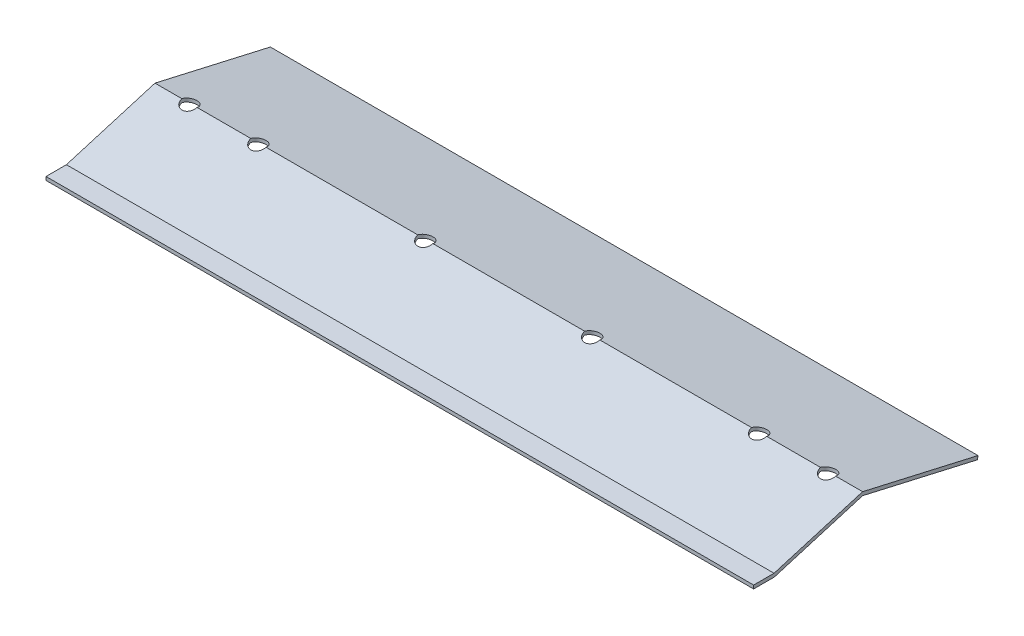
ISO-10303-21;
HEADER;
FILE_DESCRIPTION(('STEP AP214'),'2;1');
FILE_NAME('part.step','',(''),(''),'','','');
FILE_SCHEMA(('AUTOMOTIVE_DESIGN { 1 0 10303 214 1 1 1 1 }'));
ENDSEC;
DATA;
#1=APPLICATION_CONTEXT('core data for automotive mechanical design processes');
#2=APPLICATION_PROTOCOL_DEFINITION('international standard','automotive_design',2000,#1);
#3=PRODUCT_CONTEXT('',#1,'mechanical');
#4=PRODUCT('Part','Part','',(#3));
#5=PRODUCT_RELATED_PRODUCT_CATEGORY('part','',(#4));
#6=PRODUCT_DEFINITION_FORMATION('','',#4);
#7=PRODUCT_DEFINITION_CONTEXT('part definition',#1,'design');
#8=PRODUCT_DEFINITION('design','',#6,#7);
#9=PRODUCT_DEFINITION_SHAPE('','',#8);
#10=(LENGTH_UNIT() NAMED_UNIT(*) SI_UNIT(.MILLI.,.METRE.));
#11=(NAMED_UNIT(*) PLANE_ANGLE_UNIT() SI_UNIT($,.RADIAN.));
#12=(NAMED_UNIT(*) SI_UNIT($,.STERADIAN.) SOLID_ANGLE_UNIT());
#13=UNCERTAINTY_MEASURE_WITH_UNIT(LENGTH_MEASURE(1.E-05),#10,'distance_accuracy_value','');
#14=(GEOMETRIC_REPRESENTATION_CONTEXT(3) GLOBAL_UNCERTAINTY_ASSIGNED_CONTEXT((#13)) GLOBAL_UNIT_ASSIGNED_CONTEXT((#10,
#11,#12)) REPRESENTATION_CONTEXT('',''));
#15=CARTESIAN_POINT('',(0.,0.,0.));
#16=DIRECTION('',(0.,0.,1.));
#17=DIRECTION('',(1.,0.,0.));
#18=AXIS2_PLACEMENT_3D('',#15,#16,#17);
#19=CARTESIAN_POINT('',(1026.,7645.08098853702,28962.7884405451));
#20=DIRECTION('',(0.,-0.974811152910195,0.223031872524751));
#21=DIRECTION('',(0.,-0.223031872524751,-0.974811152910195));
#22=AXIS2_PLACEMENT_3D('',#19,#20,#21);
#23=PLANE('',#22);
#24=CARTESIAN_POINT('',(50.,7645.08098853702,28962.7884405451));
#25=DIRECTION('',(0.,-0.974811152910195,0.223031872524751));
#26=DIRECTION('',(0.,-0.223031872524751,-0.974811152910195));
#27=AXIS2_PLACEMENT_3D('',#24,#25,#26);
#28=ELLIPSE('',#27,11.2842369182601,11.0000000000009);
#29=CARTESIAN_POINT('',(61.0000000000009,7645.08098853702,28962.7884405451));
#30=VERTEX_POINT('',#29);
#31=CARTESIAN_POINT('',(38.9999999999991,7645.08098853702,28962.7884405451));
#32=VERTEX_POINT('',#31);
#33=EDGE_CURVE('E253',#30,#32,#28,.F.);
#34=ORIENTED_EDGE('',*,*,#33,.F.);
#35=DIRECTION('',(-1.,0.,0.));
#36=VECTOR('',#35,1.);
#37=CARTESIAN_POINT('',(1026.,7645.08098853702,28962.7884405451));
#38=LINE('',#37,#36);
#39=CARTESIAN_POINT('',(138.999999999999,7645.08098853702,28962.7884405451));
#40=VERTEX_POINT('',#39);
#41=EDGE_CURVE('E202',#40,#30,#38,.T.);
#42=ORIENTED_EDGE('',*,*,#41,.F.);
#43=CARTESIAN_POINT('',(150.,7645.08098853702,28962.7884405451));
#44=DIRECTION('',(0.,-0.974811152910195,0.223031872524751));
#45=DIRECTION('',(0.,-0.223031872524751,-0.974811152910195));
#46=AXIS2_PLACEMENT_3D('',#43,#44,#45);
#47=ELLIPSE('',#46,11.28423691826,11.0000000000009);
#48=CARTESIAN_POINT('',(161.000000000001,7645.08098853702,28962.7884405451));
#49=VERTEX_POINT('',#48);
#50=EDGE_CURVE('E258',#49,#40,#47,.F.);
#51=ORIENTED_EDGE('',*,*,#50,.F.);
#52=CARTESIAN_POINT('',(380.999999999999,7645.08098853702,28962.7884405451));
#53=VERTEX_POINT('',#52);
#54=EDGE_CURVE('E207',#53,#49,#38,.T.);
#55=ORIENTED_EDGE('',*,*,#54,.F.);
#56=CARTESIAN_POINT('',(392.,7645.08098853702,28962.7884405451));
#57=DIRECTION('',(0.,-0.974811152910195,0.223031872524751));
#58=DIRECTION('',(0.,-0.223031872524751,-0.974811152910195));
#59=AXIS2_PLACEMENT_3D('',#56,#57,#58);
#60=ELLIPSE('',#59,11.2842369182601,11.0000000000009);
#61=CARTESIAN_POINT('',(403.000000000001,7645.08098853702,28962.7884405451));
#62=VERTEX_POINT('',#61);
#63=EDGE_CURVE('E264',#62,#53,#60,.F.);
#64=ORIENTED_EDGE('',*,*,#63,.F.);
#65=CARTESIAN_POINT('',(622.999999999999,7645.08098853702,28962.7884405451));
#66=VERTEX_POINT('',#65);
#67=EDGE_CURVE('E469',#66,#62,#38,.T.);
#68=ORIENTED_EDGE('',*,*,#67,.F.);
#69=CARTESIAN_POINT('',(634.,7645.08098853702,28962.7884405451));
#70=DIRECTION('',(0.,-0.974811152910195,0.223031872524751));
#71=DIRECTION('',(0.,-0.223031872524751,-0.974811152910195));
#72=AXIS2_PLACEMENT_3D('',#69,#70,#71);
#73=ELLIPSE('',#72,11.2842369182601,11.0000000000009);
#74=CARTESIAN_POINT('',(645.000000000001,7645.08098853702,28962.7884405451));
#75=VERTEX_POINT('',#74);
#76=EDGE_CURVE('E270',#75,#66,#73,.F.);
#77=ORIENTED_EDGE('',*,*,#76,.F.);
#78=CARTESIAN_POINT('',(864.999999999999,7645.08098853702,28962.7884405451));
#79=VERTEX_POINT('',#78);
#80=EDGE_CURVE('E200',#79,#75,#38,.T.);
#81=ORIENTED_EDGE('',*,*,#80,.F.);
#82=CARTESIAN_POINT('',(876.,7645.08098853702,28962.7884405451));
#83=DIRECTION('',(0.,-0.974811152910195,0.223031872524751));
#84=DIRECTION('',(0.,-0.223031872524751,-0.974811152910195));
#85=AXIS2_PLACEMENT_3D('',#82,#83,#84);
#86=ELLIPSE('',#85,11.2842369182601,11.0000000000009);
#87=CARTESIAN_POINT('',(887.000000000001,7645.08098853702,28962.7884405451));
#88=VERTEX_POINT('',#87);
#89=EDGE_CURVE('E276',#88,#79,#86,.F.);
#90=ORIENTED_EDGE('',*,*,#89,.F.);
#91=CARTESIAN_POINT('',(964.999999999999,7645.08098853702,28962.7884405451));
#92=VERTEX_POINT('',#91);
#93=EDGE_CURVE('E187',#92,#88,#38,.T.);
#94=ORIENTED_EDGE('',*,*,#93,.F.);
#95=CARTESIAN_POINT('',(976.,7645.08098853702,28962.7884405451));
#96=DIRECTION('',(0.,-0.974811152910195,0.223031872524751));
#97=DIRECTION('',(0.,-0.223031872524751,-0.974811152910195));
#98=AXIS2_PLACEMENT_3D('',#95,#96,#97);
#99=ELLIPSE('',#98,11.2842369182601,11.0000000000009);
#100=CARTESIAN_POINT('',(987.000000000001,7645.08098853702,28962.7884405451));
#101=VERTEX_POINT('',#100);
#102=EDGE_CURVE('E172',#101,#92,#99,.F.);
#103=ORIENTED_EDGE('',*,*,#102,.F.);
#104=CARTESIAN_POINT('',(1026.,7645.08098853702,28962.7884405451));
#105=VERTEX_POINT('',#104);
#106=EDGE_CURVE('E184',#105,#101,#38,.T.);
#107=ORIENTED_EDGE('',*,*,#106,.F.);
#108=DIRECTION('',(0.,0.223031872524751,0.974811152910195));
#109=VECTOR('',#108,1.);
#110=CARTESIAN_POINT('',(1026.,7645.08098853702,28962.7884405451));
#111=LINE('',#110,#109);
#112=CARTESIAN_POINT('',(1026.,7606.80169128223,28795.4801295529));
#113=VERTEX_POINT('',#112);
#114=EDGE_CURVE('E238',#113,#105,#111,.T.);
#115=ORIENTED_EDGE('',*,*,#114,.F.);
#116=DIRECTION('',(-1.,0.,0.));
#117=VECTOR('',#116,1.);
#118=CARTESIAN_POINT('',(1026.,7606.80169128223,28795.4801295529));
#119=LINE('',#118,#117);
#120=CARTESIAN_POINT('',(0.,7606.80169128223,28795.4801295529));
#121=VERTEX_POINT('',#120);
#122=EDGE_CURVE('E194',#113,#121,#119,.T.);
#123=ORIENTED_EDGE('',*,*,#122,.T.);
#124=DIRECTION('',(0.,0.223031872524751,0.974811152910195));
#125=VECTOR('',#124,1.);
#126=CARTESIAN_POINT('',(0.,7645.08098853702,28962.7884405451));
#127=LINE('',#126,#125);
#128=CARTESIAN_POINT('',(0.,7645.08098853702,28962.7884405451));
#129=VERTEX_POINT('',#128);
#130=EDGE_CURVE('E222',#121,#129,#127,.T.);
#131=ORIENTED_EDGE('',*,*,#130,.T.);
#132=EDGE_CURVE('E196',#32,#129,#38,.T.);
#133=ORIENTED_EDGE('',*,*,#132,.F.);
#134=EDGE_LOOP('',(#34,#42,#51,#55,#64,#68,#77,#81,#90,#94,#103,#107,#115,#123,#131,#133));
#135=FACE_BOUND('',#134,.T.);
#136=ADVANCED_FACE('F33',(#135),#23,.F.);
#137=CARTESIAN_POINT('',(1026.,7606.86746050729,29091.1952717385));
#138=DIRECTION('',(0.,-0.958457773485265,-0.285234458727674));
#139=DIRECTION('',(0.,0.285234458727674,-0.958457773485265));
#140=AXIS2_PLACEMENT_3D('',#137,#138,#139);
#141=PLANE('',#140);
#142=CARTESIAN_POINT('',(50.,7645.08098853702,28962.7884405451));
#143=DIRECTION('',(0.,-0.958457773485265,-0.285234458727674));
#144=DIRECTION('',(0.,-0.285234458727674,0.958457773485265));
#145=AXIS2_PLACEMENT_3D('',#142,#143,#144);
#146=ELLIPSE('',#145,11.4767706040938,11.0000000000009);
#147=EDGE_CURVE('E11',#32,#30,#146,.F.);
#148=ORIENTED_EDGE('',*,*,#147,.F.);
#149=ORIENTED_EDGE('',*,*,#132,.T.);
#150=DIRECTION('',(0.,-0.285234458727674,0.958457773485265));
#151=VECTOR('',#150,1.);
#152=CARTESIAN_POINT('',(0.,7606.86746050729,29091.1952717385));
#153=LINE('',#152,#151);
#154=CARTESIAN_POINT('',(0.,7606.86746050729,29091.1952717385));
#155=VERTEX_POINT('',#154);
#156=EDGE_CURVE('E220',#129,#155,#153,.T.);
#157=ORIENTED_EDGE('',*,*,#156,.T.);
#158=DIRECTION('',(-1.,0.,0.));
#159=VECTOR('',#158,1.);
#160=CARTESIAN_POINT('',(1026.,7606.86746050729,29091.1952717385));
#161=LINE('',#160,#159);
#162=CARTESIAN_POINT('',(1026.,7606.86746050729,29091.1952717385));
#163=VERTEX_POINT('',#162);
#164=EDGE_CURVE('E203',#163,#155,#161,.T.);
#165=ORIENTED_EDGE('',*,*,#164,.F.);
#166=DIRECTION('',(0.,-0.285234458727674,0.958457773485265));
#167=VECTOR('',#166,1.);
#168=CARTESIAN_POINT('',(1026.,7606.86746050729,29091.1952717385));
#169=LINE('',#168,#167);
#170=EDGE_CURVE('E193',#105,#163,#169,.T.);
#171=ORIENTED_EDGE('',*,*,#170,.F.);
#172=ORIENTED_EDGE('',*,*,#106,.T.);
#173=CARTESIAN_POINT('',(976.,7645.08098853702,28962.7884405451));
#174=DIRECTION('',(0.,-0.958457773485265,-0.285234458727674));
#175=DIRECTION('',(0.,-0.285234458727674,0.958457773485265));
#176=AXIS2_PLACEMENT_3D('',#173,#174,#175);
#177=ELLIPSE('',#176,11.4767706040938,11.0000000000009);
#178=EDGE_CURVE('E168',#92,#101,#177,.F.);
#179=ORIENTED_EDGE('',*,*,#178,.F.);
#180=ORIENTED_EDGE('',*,*,#93,.T.);
#181=CARTESIAN_POINT('',(876.,7645.08098853702,28962.7884405451));
#182=DIRECTION('',(0.,-0.958457773485265,-0.285234458727674));
#183=DIRECTION('',(0.,-0.285234458727674,0.958457773485265));
#184=AXIS2_PLACEMENT_3D('',#181,#182,#183);
#185=ELLIPSE('',#184,11.4767706040938,11.0000000000009);
#186=EDGE_CURVE('E177',#79,#88,#185,.F.);
#187=ORIENTED_EDGE('',*,*,#186,.F.);
#188=ORIENTED_EDGE('',*,*,#80,.T.);
#189=CARTESIAN_POINT('',(634.,7645.08098853702,28962.7884405451));
#190=DIRECTION('',(0.,-0.958457773485265,-0.285234458727674));
#191=DIRECTION('',(0.,-0.285234458727674,0.958457773485265));
#192=AXIS2_PLACEMENT_3D('',#189,#190,#191);
#193=ELLIPSE('',#192,11.4767706040938,11.0000000000009);
#194=EDGE_CURVE('E475',#66,#75,#193,.F.);
#195=ORIENTED_EDGE('',*,*,#194,.F.);
#196=ORIENTED_EDGE('',*,*,#67,.T.);
#197=CARTESIAN_POINT('',(392.,7645.08098853702,28962.7884405451));
#198=DIRECTION('',(0.,-0.958457773485265,-0.285234458727674));
#199=DIRECTION('',(0.,-0.285234458727674,0.958457773485265));
#200=AXIS2_PLACEMENT_3D('',#197,#198,#199);
#201=ELLIPSE('',#200,11.4767706040938,11.0000000000009);
#202=EDGE_CURVE('E468',#53,#62,#201,.F.);
#203=ORIENTED_EDGE('',*,*,#202,.F.);
#204=ORIENTED_EDGE('',*,*,#54,.T.);
#205=CARTESIAN_POINT('',(150.,7645.08098853702,28962.7884405451));
#206=DIRECTION('',(0.,-0.958457773485265,-0.285234458727674));
#207=DIRECTION('',(0.,-0.285234458727674,0.958457773485265));
#208=AXIS2_PLACEMENT_3D('',#205,#206,#207);
#209=ELLIPSE('',#208,11.4767706040938,11.0000000000009);
#210=EDGE_CURVE('E41',#40,#49,#209,.F.);
#211=ORIENTED_EDGE('',*,*,#210,.F.);
#212=ORIENTED_EDGE('',*,*,#41,.T.);
#213=EDGE_LOOP('',(#148,#149,#157,#165,#171,#172,#179,#180,#187,#188,#195,#196,#203,#204,#211,#212));
#214=FACE_BOUND('',#213,.T.);
#215=ADVANCED_FACE('F191',(#214),#141,.F.);
#216=CARTESIAN_POINT('',(1026.,7601.86746050729,29120.7884405453));
#217=DIRECTION('',(0.,-7.10542735759232E-13,-1.));
#218=DIRECTION('',(0.,1.,-7.10542735759232E-13));
#219=AXIS2_PLACEMENT_3D('',#216,#217,#218);
#220=PLANE('',#219);
#221=DIRECTION('',(0.,-1.,7.10542735759232E-13));
#222=VECTOR('',#221,1.);
#223=CARTESIAN_POINT('',(0.,7601.86746050729,29120.7884405453));
#224=LINE('',#223,#222);
#225=CARTESIAN_POINT('',(0.,7606.86746050729,29120.7884405453));
#226=VERTEX_POINT('',#225);
#227=CARTESIAN_POINT('',(0.,7601.86746050729,29120.7884405453));
#228=VERTEX_POINT('',#227);
#229=EDGE_CURVE('E233',#226,#228,#224,.T.);
#230=ORIENTED_EDGE('',*,*,#229,.T.);
#231=DIRECTION('',(-1.,0.,0.));
#232=VECTOR('',#231,1.);
#233=CARTESIAN_POINT('',(1026.,7601.86746050729,29120.7884405453));
#234=LINE('',#233,#232);
#235=CARTESIAN_POINT('',(1026.,7601.86746050729,29120.7884405453));
#236=VERTEX_POINT('',#235);
#237=EDGE_CURVE('E178',#236,#228,#234,.T.);
#238=ORIENTED_EDGE('',*,*,#237,.F.);
#239=DIRECTION('',(0.,-1.,7.10542735759232E-13));
#240=VECTOR('',#239,1.);
#241=CARTESIAN_POINT('',(1026.,7601.86746050729,29120.7884405453));
#242=LINE('',#241,#240);
#243=CARTESIAN_POINT('',(1026.,7606.86746050729,29120.7884405453));
#244=VERTEX_POINT('',#243);
#245=EDGE_CURVE('E219',#244,#236,#242,.T.);
#246=ORIENTED_EDGE('',*,*,#245,.F.);
#247=DIRECTION('',(-1.,0.,0.));
#248=VECTOR('',#247,1.);
#249=CARTESIAN_POINT('',(1026.,7606.86746050729,29120.7884405453));
#250=LINE('',#249,#248);
#251=EDGE_CURVE('E209',#244,#226,#250,.T.);
#252=ORIENTED_EDGE('',*,*,#251,.T.);
#253=EDGE_LOOP('',(#230,#238,#246,#252));
#254=FACE_BOUND('',#253,.T.);
#255=ADVANCED_FACE('F35',(#254),#220,.F.);
#256=CARTESIAN_POINT('',(1026.,7601.86746050729,29090.7884405453));
#257=DIRECTION('',(0.,1.,0.));
#258=DIRECTION('',(0.,0.,1.));
#259=AXIS2_PLACEMENT_3D('',#256,#257,#258);
#260=PLANE('',#259);
#261=DIRECTION('',(0.,0.,-1.));
#262=VECTOR('',#261,1.);
#263=CARTESIAN_POINT('',(0.,7601.86746050729,29090.7884405453));
#264=LINE('',#263,#262);
#265=CARTESIAN_POINT('',(0.,7601.86746050729,29090.7884405453));
#266=VERTEX_POINT('',#265);
#267=EDGE_CURVE('E231',#228,#266,#264,.T.);
#268=ORIENTED_EDGE('',*,*,#267,.T.);
#269=DIRECTION('',(-1.,0.,0.));
#270=VECTOR('',#269,1.);
#271=CARTESIAN_POINT('',(1026.,7601.86746050729,29090.7884405453));
#272=LINE('',#271,#270);
#273=CARTESIAN_POINT('',(1026.,7601.86746050729,29090.7884405453));
#274=VERTEX_POINT('',#273);
#275=EDGE_CURVE('E296',#274,#266,#272,.T.);
#276=ORIENTED_EDGE('',*,*,#275,.F.);
#277=DIRECTION('',(0.,0.,-1.));
#278=VECTOR('',#277,1.);
#279=CARTESIAN_POINT('',(1026.,7601.86746050729,29090.7884405453));
#280=LINE('',#279,#278);
#281=EDGE_CURVE('E246',#236,#274,#280,.T.);
#282=ORIENTED_EDGE('',*,*,#281,.F.);
#283=ORIENTED_EDGE('',*,*,#237,.T.);
#284=EDGE_LOOP('',(#268,#276,#282,#283));
#285=FACE_BOUND('',#284,.T.);
#286=ADVANCED_FACE('F326',(#285),#260,.F.);
#287=CARTESIAN_POINT('',(1026.,7640.01434266244,28962.7884405451));
#288=DIRECTION('',(0.,0.958346298160574,0.285608775778904));
#289=DIRECTION('',(0.,-0.285608775778904,0.958346298160574));
#290=AXIS2_PLACEMENT_3D('',#287,#288,#289);
#291=PLANE('',#290);
#292=CARTESIAN_POINT('',(50.,7640.01434266244,28962.7884405451));
#293=DIRECTION('',(0.,0.958346298160574,0.285608775778904));
#294=DIRECTION('',(0.,-0.285608775778904,0.958346298160574));
#295=AXIS2_PLACEMENT_3D('',#292,#293,#294);
#296=ELLIPSE('',#295,11.4781055878381,11.0000000000009);
#297=CARTESIAN_POINT('',(61.0000000000009,7640.01434266244,28962.7884405451));
#298=VERTEX_POINT('',#297);
#299=CARTESIAN_POINT('',(38.9999999999991,7640.01434266244,28962.7884405451));
#300=VERTEX_POINT('',#299);
#301=EDGE_CURVE('E47',#298,#300,#296,.F.);
#302=ORIENTED_EDGE('',*,*,#301,.F.);
#303=DIRECTION('',(-1.,0.,0.));
#304=VECTOR('',#303,1.);
#305=CARTESIAN_POINT('',(1026.,7640.01434266244,28962.7884405451));
#306=LINE('',#305,#304);
#307=CARTESIAN_POINT('',(138.999999999999,7640.01434266244,28962.7884405451));
#308=VERTEX_POINT('',#307);
#309=EDGE_CURVE('E303',#308,#298,#306,.T.);
#310=ORIENTED_EDGE('',*,*,#309,.F.);
#311=CARTESIAN_POINT('',(150.,7640.01434266244,28962.7884405451));
#312=DIRECTION('',(0.,0.958346298160574,0.285608775778904));
#313=DIRECTION('',(0.,-0.285608775778904,0.958346298160574));
#314=AXIS2_PLACEMENT_3D('',#311,#312,#313);
#315=ELLIPSE('',#314,11.4781055878381,11.0000000000009);
#316=CARTESIAN_POINT('',(161.000000000001,7640.01434266244,28962.7884405451));
#317=VERTEX_POINT('',#316);
#318=EDGE_CURVE('E54',#317,#308,#315,.F.);
#319=ORIENTED_EDGE('',*,*,#318,.F.);
#320=CARTESIAN_POINT('',(380.999999999999,7640.01434266244,28962.7884405451));
#321=VERTEX_POINT('',#320);
#322=EDGE_CURVE('E306',#321,#317,#306,.T.);
#323=ORIENTED_EDGE('',*,*,#322,.F.);
#324=CARTESIAN_POINT('',(392.,7640.01434266244,28962.7884405451));
#325=DIRECTION('',(0.,0.958346298160574,0.285608775778904));
#326=DIRECTION('',(0.,-0.285608775778904,0.958346298160574));
#327=AXIS2_PLACEMENT_3D('',#324,#325,#326);
#328=ELLIPSE('',#327,11.4781055878382,11.0000000000009);
#329=CARTESIAN_POINT('',(403.000000000001,7640.01434266244,28962.7884405451));
#330=VERTEX_POINT('',#329);
#331=EDGE_CURVE('E260',#330,#321,#328,.F.);
#332=ORIENTED_EDGE('',*,*,#331,.F.);
#333=CARTESIAN_POINT('',(622.999999999999,7640.01434266244,28962.7884405451));
#334=VERTEX_POINT('',#333);
#335=EDGE_CURVE('E488',#334,#330,#306,.T.);
#336=ORIENTED_EDGE('',*,*,#335,.F.);
#337=CARTESIAN_POINT('',(634.,7640.01434266244,28962.7884405451));
#338=DIRECTION('',(0.,0.958346298160574,0.285608775778904));
#339=DIRECTION('',(0.,-0.285608775778904,0.958346298160574));
#340=AXIS2_PLACEMENT_3D('',#337,#338,#339);
#341=ELLIPSE('',#340,11.4781055878382,11.0000000000009);
#342=CARTESIAN_POINT('',(645.000000000001,7640.01434266244,28962.7884405451));
#343=VERTEX_POINT('',#342);
#344=EDGE_CURVE('E266',#343,#334,#341,.F.);
#345=ORIENTED_EDGE('',*,*,#344,.F.);
#346=CARTESIAN_POINT('',(864.999999999999,7640.01434266244,28962.7884405451));
#347=VERTEX_POINT('',#346);
#348=EDGE_CURVE('E301',#347,#343,#306,.T.);
#349=ORIENTED_EDGE('',*,*,#348,.F.);
#350=CARTESIAN_POINT('',(876.,7640.01434266244,28962.7884405451));
#351=DIRECTION('',(0.,0.958346298160574,0.285608775778904));
#352=DIRECTION('',(0.,-0.285608775778904,0.958346298160574));
#353=AXIS2_PLACEMENT_3D('',#350,#351,#352);
#354=ELLIPSE('',#353,11.4781055878382,11.0000000000009);
#355=CARTESIAN_POINT('',(887.000000000001,7640.01434266244,28962.7884405451));
#356=VERTEX_POINT('',#355);
#357=EDGE_CURVE('E272',#356,#347,#354,.F.);
#358=ORIENTED_EDGE('',*,*,#357,.F.);
#359=CARTESIAN_POINT('',(964.999999999999,7640.01434266244,28962.7884405451));
#360=VERTEX_POINT('',#359);
#361=EDGE_CURVE('E293',#360,#356,#306,.T.);
#362=ORIENTED_EDGE('',*,*,#361,.F.);
#363=CARTESIAN_POINT('',(976.,7640.01434266244,28962.7884405451));
#364=DIRECTION('',(0.,0.958346298160574,0.285608775778904));
#365=DIRECTION('',(0.,-0.285608775778904,0.958346298160574));
#366=AXIS2_PLACEMENT_3D('',#363,#364,#365);
#367=ELLIPSE('',#366,11.4781055878382,11.0000000000009);
#368=CARTESIAN_POINT('',(987.000000000001,7640.01434266244,28962.7884405451));
#369=VERTEX_POINT('',#368);
#370=EDGE_CURVE('E278',#369,#360,#367,.F.);
#371=ORIENTED_EDGE('',*,*,#370,.F.);
#372=CARTESIAN_POINT('',(1026.,7640.01434266244,28962.7884405451));
#373=VERTEX_POINT('',#372);
#374=EDGE_CURVE('E290',#373,#369,#306,.T.);
#375=ORIENTED_EDGE('',*,*,#374,.F.);
#376=DIRECTION('',(0.,0.285608775778904,-0.958346298160574));
#377=VECTOR('',#376,1.);
#378=CARTESIAN_POINT('',(1026.,7640.01434266244,28962.7884405451));
#379=LINE('',#378,#377);
#380=EDGE_CURVE('E244',#274,#373,#379,.T.);
#381=ORIENTED_EDGE('',*,*,#380,.F.);
#382=ORIENTED_EDGE('',*,*,#275,.T.);
#383=DIRECTION('',(0.,0.285608775778904,-0.958346298160574));
#384=VECTOR('',#383,1.);
#385=CARTESIAN_POINT('',(0.,7640.01434266244,28962.7884405451));
#386=LINE('',#385,#384);
#387=CARTESIAN_POINT('',(0.,7640.01434266244,28962.7884405451));
#388=VERTEX_POINT('',#387);
#389=EDGE_CURVE('E228',#266,#388,#386,.T.);
#390=ORIENTED_EDGE('',*,*,#389,.T.);
#391=EDGE_CURVE('E298',#300,#388,#306,.T.);
#392=ORIENTED_EDGE('',*,*,#391,.F.);
#393=EDGE_LOOP('',(#302,#310,#319,#323,#332,#336,#345,#349,#358,#362,#371,#375,#381,#382,#390,#392));
#394=FACE_BOUND('',#393,.T.);
#395=ADVANCED_FACE('F288',(#394),#291,.F.);
#396=CARTESIAN_POINT('',(1026.,7601.86746050729,28796.2884405449));
#397=DIRECTION('',(0.,0.974744258070148,-0.223324050113899));
#398=DIRECTION('',(0.,0.2233240501139,0.974744258070149));
#399=AXIS2_PLACEMENT_3D('',#396,#397,#398);
#400=PLANE('',#399);
#401=CARTESIAN_POINT('',(50.,7640.01434266244,28962.7884405451));
#402=DIRECTION('',(0.,0.974744258070148,-0.223324050113899));
#403=DIRECTION('',(0.,-0.2233240501139,-0.974744258070149));
#404=AXIS2_PLACEMENT_3D('',#401,#402,#403);
#405=ELLIPSE('',#404,11.285011333926,11.0000000000009);
#406=EDGE_CURVE('E251',#300,#298,#405,.F.);
#407=ORIENTED_EDGE('',*,*,#406,.F.);
#408=ORIENTED_EDGE('',*,*,#391,.T.);
#409=DIRECTION('',(0.,-0.2233240501139,-0.974744258070149));
#410=VECTOR('',#409,1.);
#411=CARTESIAN_POINT('',(0.,7601.86746050729,28796.2884405449));
#412=LINE('',#411,#410);
#413=CARTESIAN_POINT('',(0.,7601.86746050729,28796.2884405449));
#414=VERTEX_POINT('',#413);
#415=EDGE_CURVE('E226',#388,#414,#412,.T.);
#416=ORIENTED_EDGE('',*,*,#415,.T.);
#417=DIRECTION('',(-1.,0.,0.));
#418=VECTOR('',#417,1.);
#419=CARTESIAN_POINT('',(1026.,7601.86746050729,28796.2884405449));
#420=LINE('',#419,#418);
#421=CARTESIAN_POINT('',(1026.,7601.86746050729,28796.2884405449));
#422=VERTEX_POINT('',#421);
#423=EDGE_CURVE('E198',#422,#414,#420,.T.);
#424=ORIENTED_EDGE('',*,*,#423,.F.);
#425=DIRECTION('',(0.,-0.2233240501139,-0.974744258070149));
#426=VECTOR('',#425,1.);
#427=CARTESIAN_POINT('',(1026.,7601.86746050729,28796.2884405449));
#428=LINE('',#427,#426);
#429=EDGE_CURVE('E242',#373,#422,#428,.T.);
#430=ORIENTED_EDGE('',*,*,#429,.F.);
#431=ORIENTED_EDGE('',*,*,#374,.T.);
#432=CARTESIAN_POINT('',(976.,7640.01434266244,28962.7884405451));
#433=DIRECTION('',(0.,0.974744258070148,-0.223324050113899));
#434=DIRECTION('',(0.,-0.2233240501139,-0.974744258070149));
#435=AXIS2_PLACEMENT_3D('',#432,#433,#434);
#436=ELLIPSE('',#435,11.285011333926,11.0000000000009);
#437=EDGE_CURVE('E188',#360,#369,#436,.F.);
#438=ORIENTED_EDGE('',*,*,#437,.F.);
#439=ORIENTED_EDGE('',*,*,#361,.T.);
#440=CARTESIAN_POINT('',(876.,7640.01434266244,28962.7884405451));
#441=DIRECTION('',(0.,0.974744258070148,-0.223324050113899));
#442=DIRECTION('',(0.,-0.2233240501139,-0.974744258070149));
#443=AXIS2_PLACEMENT_3D('',#440,#441,#442);
#444=ELLIPSE('',#443,11.285011333926,11.0000000000009);
#445=EDGE_CURVE('E274',#347,#356,#444,.F.);
#446=ORIENTED_EDGE('',*,*,#445,.F.);
#447=ORIENTED_EDGE('',*,*,#348,.T.);
#448=CARTESIAN_POINT('',(634.,7640.01434266244,28962.7884405451));
#449=DIRECTION('',(0.,0.974744258070148,-0.223324050113899));
#450=DIRECTION('',(0.,-0.2233240501139,-0.974744258070149));
#451=AXIS2_PLACEMENT_3D('',#448,#449,#450);
#452=ELLIPSE('',#451,11.285011333926,11.0000000000009);
#453=EDGE_CURVE('E268',#334,#343,#452,.F.);
#454=ORIENTED_EDGE('',*,*,#453,.F.);
#455=ORIENTED_EDGE('',*,*,#335,.T.);
#456=CARTESIAN_POINT('',(392.,7640.01434266244,28962.7884405451));
#457=DIRECTION('',(0.,0.974744258070148,-0.223324050113899));
#458=DIRECTION('',(0.,-0.2233240501139,-0.974744258070149));
#459=AXIS2_PLACEMENT_3D('',#456,#457,#458);
#460=ELLIPSE('',#459,11.285011333926,11.0000000000009);
#461=EDGE_CURVE('E262',#321,#330,#460,.F.);
#462=ORIENTED_EDGE('',*,*,#461,.F.);
#463=ORIENTED_EDGE('',*,*,#322,.T.);
#464=CARTESIAN_POINT('',(150.,7640.01434266244,28962.7884405451));
#465=DIRECTION('',(0.,0.974744258070148,-0.223324050113899));
#466=DIRECTION('',(0.,-0.2233240501139,-0.974744258070149));
#467=AXIS2_PLACEMENT_3D('',#464,#465,#466);
#468=ELLIPSE('',#467,11.2850113339259,11.0000000000009);
#469=EDGE_CURVE('E256',#308,#317,#468,.F.);
#470=ORIENTED_EDGE('',*,*,#469,.F.);
#471=ORIENTED_EDGE('',*,*,#309,.T.);
#472=EDGE_LOOP('',(#407,#408,#416,#424,#430,#431,#438,#439,#446,#447,#454,#455,#462,#463,#470,#471));
#473=FACE_BOUND('',#472,.T.);
#474=ADVANCED_FACE('F294',(#473),#400,.F.);
#475=CARTESIAN_POINT('',(1026.,7606.80169128223,28795.4801295529));
#476=DIRECTION('',(0.,0.16166219839117,0.986846154986346));
#477=DIRECTION('',(0.,-0.986846154986346,0.16166219839117));
#478=AXIS2_PLACEMENT_3D('',#475,#476,#477);
#479=PLANE('',#478);
#480=DIRECTION('',(0.,0.986846154986345,-0.16166219839117));
#481=VECTOR('',#480,1.);
#482=CARTESIAN_POINT('',(0.,7606.80169128223,28795.4801295529));
#483=LINE('',#482,#481);
#484=EDGE_CURVE('E224',#414,#121,#483,.T.);
#485=ORIENTED_EDGE('',*,*,#484,.T.);
#486=ORIENTED_EDGE('',*,*,#122,.F.);
#487=DIRECTION('',(0.,0.986846154986345,-0.16166219839117));
#488=VECTOR('',#487,1.);
#489=CARTESIAN_POINT('',(1026.,7606.80169128223,28795.4801295529));
#490=LINE('',#489,#488);
#491=EDGE_CURVE('E240',#422,#113,#490,.T.);
#492=ORIENTED_EDGE('',*,*,#491,.F.);
#493=ORIENTED_EDGE('',*,*,#423,.T.);
#494=EDGE_LOOP('',(#485,#486,#492,#493));
#495=FACE_BOUND('',#494,.T.);
#496=ADVANCED_FACE('F311',(#495),#479,.F.);
#497=CARTESIAN_POINT('',(1026.,7606.86746050729,29120.7884405453));
#498=DIRECTION('',(0.,-1.,0.));
#499=DIRECTION('',(0.,0.,-1.));
#500=AXIS2_PLACEMENT_3D('',#497,#498,#499);
#501=PLANE('',#500);
#502=DIRECTION('',(0.,0.,1.));
#503=VECTOR('',#502,1.);
#504=CARTESIAN_POINT('',(0.,7606.86746050729,29120.7884405453));
#505=LINE('',#504,#503);
#506=EDGE_CURVE('E217',#155,#226,#505,.T.);
#507=ORIENTED_EDGE('',*,*,#506,.T.);
#508=ORIENTED_EDGE('',*,*,#251,.F.);
#509=DIRECTION('',(0.,0.,1.));
#510=VECTOR('',#509,1.);
#511=CARTESIAN_POINT('',(1026.,7606.86746050729,29120.7884405453));
#512=LINE('',#511,#510);
#513=EDGE_CURVE('E214',#163,#244,#512,.T.);
#514=ORIENTED_EDGE('',*,*,#513,.F.);
#515=ORIENTED_EDGE('',*,*,#164,.T.);
#516=EDGE_LOOP('',(#507,#508,#514,#515));
#517=FACE_BOUND('',#516,.T.);
#518=ADVANCED_FACE('F331',(#517),#501,.F.);
#519=CARTESIAN_POINT('',(1026.,0.,0.));
#520=DIRECTION('',(-1.,0.,0.));
#521=DIRECTION('',(0.,0.,1.));
#522=AXIS2_PLACEMENT_3D('',#519,#520,#521);
#523=PLANE('',#522);
#524=ORIENTED_EDGE('',*,*,#245,.T.);
#525=ORIENTED_EDGE('',*,*,#281,.T.);
#526=ORIENTED_EDGE('',*,*,#380,.T.);
#527=ORIENTED_EDGE('',*,*,#429,.T.);
#528=ORIENTED_EDGE('',*,*,#491,.T.);
#529=ORIENTED_EDGE('',*,*,#114,.T.);
#530=ORIENTED_EDGE('',*,*,#170,.T.);
#531=ORIENTED_EDGE('',*,*,#513,.T.);
#532=EDGE_LOOP('',(#524,#525,#526,#527,#528,#529,#530,#531));
#533=FACE_BOUND('',#532,.T.);
#534=ADVANCED_FACE('F321',(#533),#523,.F.);
#535=CARTESIAN_POINT('',(0.,0.,0.));
#536=DIRECTION('',(-1.,0.,0.));
#537=DIRECTION('',(0.,0.,1.));
#538=AXIS2_PLACEMENT_3D('',#535,#536,#537);
#539=PLANE('',#538);
#540=ORIENTED_EDGE('',*,*,#229,.F.);
#541=ORIENTED_EDGE('',*,*,#506,.F.);
#542=ORIENTED_EDGE('',*,*,#156,.F.);
#543=ORIENTED_EDGE('',*,*,#130,.F.);
#544=ORIENTED_EDGE('',*,*,#484,.F.);
#545=ORIENTED_EDGE('',*,*,#415,.F.);
#546=ORIENTED_EDGE('',*,*,#389,.F.);
#547=ORIENTED_EDGE('',*,*,#267,.F.);
#548=EDGE_LOOP('',(#540,#541,#542,#543,#544,#545,#546,#547));
#549=FACE_BOUND('',#548,.T.);
#550=ADVANCED_FACE('F317',(#549),#539,.T.);
#551=CARTESIAN_POINT('',(976.,7601.86746050729,28962.7884405451));
#552=DIRECTION('',(0.,-1.,0.));
#553=DIRECTION('',(0.,0.,-1.));
#554=AXIS2_PLACEMENT_3D('',#551,#552,#553);
#555=CYLINDRICAL_SURFACE('',#554,11.0000000000009);
#556=ORIENTED_EDGE('',*,*,#102,.T.);
#557=ORIENTED_EDGE('',*,*,#178,.T.);
#558=EDGE_LOOP('',(#556,#557));
#559=FACE_BOUND('',#558,.T.);
#560=ORIENTED_EDGE('',*,*,#370,.T.);
#561=ORIENTED_EDGE('',*,*,#437,.T.);
#562=EDGE_LOOP('',(#560,#561));
#563=FACE_BOUND('',#562,.T.);
#564=ADVANCED_FACE('F170',(#559,#563),#555,.F.);
#565=CARTESIAN_POINT('',(876.,7601.86746050729,28962.7884405451));
#566=DIRECTION('',(0.,-1.,0.));
#567=DIRECTION('',(0.,0.,-1.));
#568=AXIS2_PLACEMENT_3D('',#565,#566,#567);
#569=CYLINDRICAL_SURFACE('',#568,11.0000000000009);
#570=ORIENTED_EDGE('',*,*,#89,.T.);
#571=ORIENTED_EDGE('',*,*,#186,.T.);
#572=EDGE_LOOP('',(#570,#571));
#573=FACE_BOUND('',#572,.T.);
#574=ORIENTED_EDGE('',*,*,#357,.T.);
#575=ORIENTED_EDGE('',*,*,#445,.T.);
#576=EDGE_LOOP('',(#574,#575));
#577=FACE_BOUND('',#576,.T.);
#578=ADVANCED_FACE('F407',(#573,#577),#569,.F.);
#579=CARTESIAN_POINT('',(634.,7601.86746050729,28962.7884405451));
#580=DIRECTION('',(0.,-1.,0.));
#581=DIRECTION('',(0.,0.,-1.));
#582=AXIS2_PLACEMENT_3D('',#579,#580,#581);
#583=CYLINDRICAL_SURFACE('',#582,11.0000000000009);
#584=ORIENTED_EDGE('',*,*,#76,.T.);
#585=ORIENTED_EDGE('',*,*,#194,.T.);
#586=EDGE_LOOP('',(#584,#585));
#587=FACE_BOUND('',#586,.T.);
#588=ORIENTED_EDGE('',*,*,#344,.T.);
#589=ORIENTED_EDGE('',*,*,#453,.T.);
#590=EDGE_LOOP('',(#588,#589));
#591=FACE_BOUND('',#590,.T.);
#592=ADVANCED_FACE('F413',(#587,#591),#583,.F.);
#593=CARTESIAN_POINT('',(392.,7601.86746050729,28962.7884405451));
#594=DIRECTION('',(0.,-1.,0.));
#595=DIRECTION('',(0.,0.,-1.));
#596=AXIS2_PLACEMENT_3D('',#593,#594,#595);
#597=CYLINDRICAL_SURFACE('',#596,11.0000000000009);
#598=ORIENTED_EDGE('',*,*,#63,.T.);
#599=ORIENTED_EDGE('',*,*,#202,.T.);
#600=EDGE_LOOP('',(#598,#599));
#601=FACE_BOUND('',#600,.T.);
#602=ORIENTED_EDGE('',*,*,#331,.T.);
#603=ORIENTED_EDGE('',*,*,#461,.T.);
#604=EDGE_LOOP('',(#602,#603));
#605=FACE_BOUND('',#604,.T.);
#606=ADVANCED_FACE('F421',(#601,#605),#597,.F.);
#607=CARTESIAN_POINT('',(150.,7601.86746050729,28962.7884405451));
#608=DIRECTION('',(0.,-1.,0.));
#609=DIRECTION('',(0.,0.,-1.));
#610=AXIS2_PLACEMENT_3D('',#607,#608,#609);
#611=CYLINDRICAL_SURFACE('',#610,11.0000000000009);
#612=ORIENTED_EDGE('',*,*,#50,.T.);
#613=ORIENTED_EDGE('',*,*,#210,.T.);
#614=EDGE_LOOP('',(#612,#613));
#615=FACE_BOUND('',#614,.T.);
#616=ORIENTED_EDGE('',*,*,#318,.T.);
#617=ORIENTED_EDGE('',*,*,#469,.T.);
#618=EDGE_LOOP('',(#616,#617));
#619=FACE_BOUND('',#618,.T.);
#620=ADVANCED_FACE('F429',(#615,#619),#611,.F.);
#621=CARTESIAN_POINT('',(50.,7601.86746050729,28962.7884405451));
#622=DIRECTION('',(0.,-1.,0.));
#623=DIRECTION('',(0.,0.,-1.));
#624=AXIS2_PLACEMENT_3D('',#621,#622,#623);
#625=CYLINDRICAL_SURFACE('',#624,11.0000000000009);
#626=ORIENTED_EDGE('',*,*,#33,.T.);
#627=ORIENTED_EDGE('',*,*,#147,.T.);
#628=EDGE_LOOP('',(#626,#627));
#629=FACE_BOUND('',#628,.T.);
#630=ORIENTED_EDGE('',*,*,#301,.T.);
#631=ORIENTED_EDGE('',*,*,#406,.T.);
#632=EDGE_LOOP('',(#630,#631));
#633=FACE_BOUND('',#632,.T.);
#634=ADVANCED_FACE('F437',(#629,#633),#625,.F.);
#635=CLOSED_SHELL('',(#136,#215,#255,#286,#395,#474,#496,#518,#534,#550,#564,#578,#592,#606,
#620,#634));
#636=MANIFOLD_SOLID_BREP('B2',#635);
#637=ADVANCED_BREP_SHAPE_REPRESENTATION('',(#18,#636),#14);
#638=SHAPE_DEFINITION_REPRESENTATION(#9,#637);
ENDSEC;
END-ISO-10303-21;
